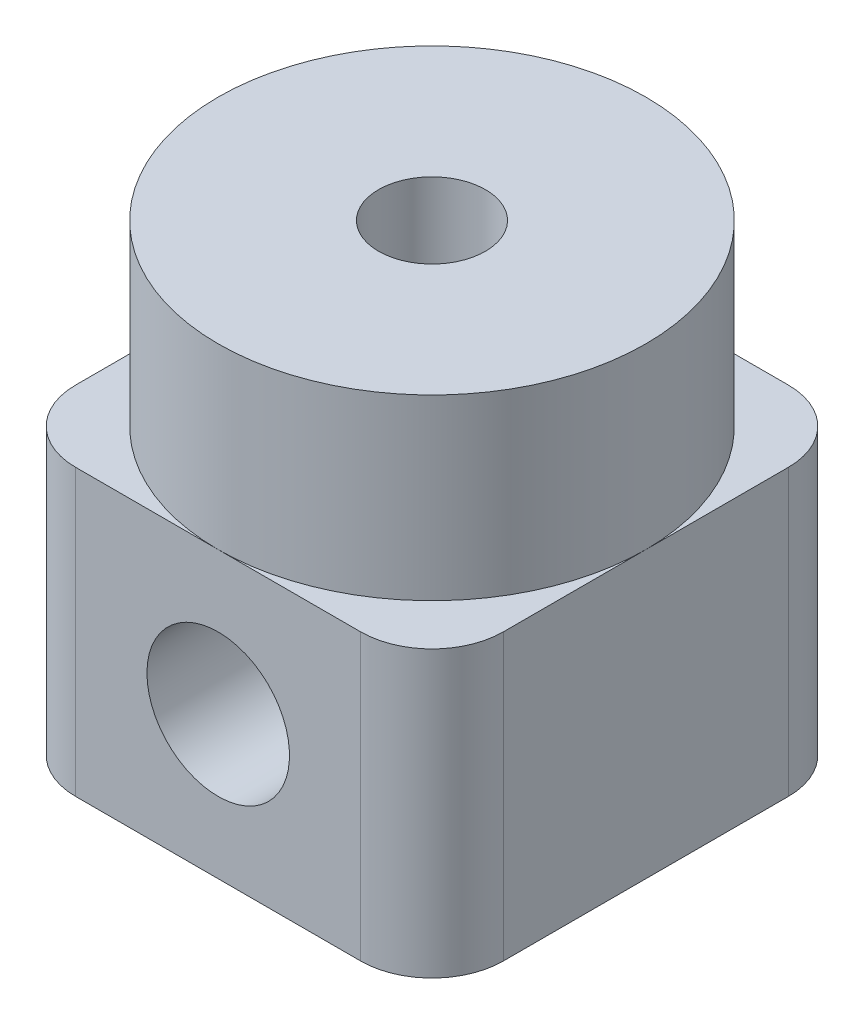
ISO-10303-21;
HEADER;
FILE_DESCRIPTION(('STEP AP214'),'2;1');
FILE_NAME('part.step','',(''),(''),'','','');
FILE_SCHEMA(('AUTOMOTIVE_DESIGN { 1 0 10303 214 1 1 1 1 }'));
ENDSEC;
DATA;
#1=APPLICATION_CONTEXT('core data for automotive mechanical design processes');
#2=APPLICATION_PROTOCOL_DEFINITION('international standard','automotive_design',2000,#1);
#3=PRODUCT_CONTEXT('',#1,'mechanical');
#4=PRODUCT('Part','Part','',(#3));
#5=PRODUCT_RELATED_PRODUCT_CATEGORY('part','',(#4));
#6=PRODUCT_DEFINITION_FORMATION('','',#4);
#7=PRODUCT_DEFINITION_CONTEXT('part definition',#1,'design');
#8=PRODUCT_DEFINITION('design','',#6,#7);
#9=PRODUCT_DEFINITION_SHAPE('','',#8);
#10=(LENGTH_UNIT() NAMED_UNIT(*) SI_UNIT(.MILLI.,.METRE.));
#11=(NAMED_UNIT(*) PLANE_ANGLE_UNIT() SI_UNIT($,.RADIAN.));
#12=(NAMED_UNIT(*) SI_UNIT($,.STERADIAN.) SOLID_ANGLE_UNIT());
#13=UNCERTAINTY_MEASURE_WITH_UNIT(LENGTH_MEASURE(1.E-05),#10,'distance_accuracy_value','');
#14=(GEOMETRIC_REPRESENTATION_CONTEXT(3) GLOBAL_UNCERTAINTY_ASSIGNED_CONTEXT((#13)) GLOBAL_UNIT_ASSIGNED_CONTEXT((#10,
#11,#12)) REPRESENTATION_CONTEXT('',''));
#15=CARTESIAN_POINT('',(0.,0.,0.));
#16=DIRECTION('',(0.,0.,1.));
#17=DIRECTION('',(1.,0.,0.));
#18=AXIS2_PLACEMENT_3D('',#15,#16,#17);
#19=CARTESIAN_POINT('',(0.,5.,0.));
#20=DIRECTION('',(0.,-1.,0.));
#21=DIRECTION('',(0.,0.,-1.));
#22=AXIS2_PLACEMENT_3D('',#19,#20,#21);
#23=CYLINDRICAL_SURFACE('',#22,6.);
#24=CARTESIAN_POINT('',(0.,5.,0.));
#25=DIRECTION('',(0.,1.,0.));
#26=DIRECTION('',(0.,0.,1.));
#27=AXIS2_PLACEMENT_3D('',#24,#25,#26);
#28=CIRCLE('',#27,6.);
#29=CARTESIAN_POINT('',(0.,5.,6.));
#30=VERTEX_POINT('',#29);
#31=EDGE_CURVE('E148',#30,#30,#28,.T.);
#32=ORIENTED_EDGE('',*,*,#31,.F.);
#33=EDGE_LOOP('',(#32));
#34=FACE_BOUND('',#33,.T.);
#35=CARTESIAN_POINT('',(0.,0.,0.));
#36=DIRECTION('',(0.,1.,0.));
#37=DIRECTION('',(0.,0.,1.));
#38=AXIS2_PLACEMENT_3D('',#35,#36,#37);
#39=CIRCLE('',#38,6.);
#40=CARTESIAN_POINT('',(0.,0.,6.));
#41=VERTEX_POINT('',#40);
#42=CARTESIAN_POINT('',(6.,0.,0.));
#43=VERTEX_POINT('',#42);
#44=EDGE_CURVE('E147',#41,#43,#39,.T.);
#45=ORIENTED_EDGE('',*,*,#44,.T.);
#46=CARTESIAN_POINT('',(0.,0.,-6.));
#47=VERTEX_POINT('',#46);
#48=EDGE_CURVE('E118',#43,#47,#39,.T.);
#49=ORIENTED_EDGE('',*,*,#48,.T.);
#50=CARTESIAN_POINT('',(-6.,0.,0.));
#51=VERTEX_POINT('',#50);
#52=EDGE_CURVE('E130',#47,#51,#39,.T.);
#53=ORIENTED_EDGE('',*,*,#52,.T.);
#54=EDGE_CURVE('E137',#51,#41,#39,.T.);
#55=ORIENTED_EDGE('',*,*,#54,.T.);
#56=EDGE_LOOP('',(#45,#49,#53,#55));
#57=FACE_BOUND('',#56,.T.);
#58=ADVANCED_FACE('F37',(#34,#57),#23,.T.);
#59=CARTESIAN_POINT('',(0.,5.,0.));
#60=DIRECTION('',(0.,1.,0.));
#61=DIRECTION('',(0.,0.,1.));
#62=AXIS2_PLACEMENT_3D('',#59,#60,#61);
#63=PLANE('',#62);
#64=CARTESIAN_POINT('',(0.,5.,0.));
#65=DIRECTION('',(0.,1.,0.));
#66=DIRECTION('',(0.,0.,1.));
#67=AXIS2_PLACEMENT_3D('',#64,#65,#66);
#68=CIRCLE('',#67,1.5);
#69=CARTESIAN_POINT('',(0.,5.,1.5));
#70=VERTEX_POINT('',#69);
#71=EDGE_CURVE('E215',#70,#70,#68,.T.);
#72=ORIENTED_EDGE('',*,*,#71,.F.);
#73=EDGE_LOOP('',(#72));
#74=FACE_BOUND('',#73,.T.);
#75=ORIENTED_EDGE('',*,*,#31,.T.);
#76=EDGE_LOOP('',(#75));
#77=FACE_BOUND('',#76,.T.);
#78=ADVANCED_FACE('F247',(#74,#77),#63,.T.);
#79=CARTESIAN_POINT('',(0.,0.,0.));
#80=DIRECTION('',(0.,1.,0.));
#81=DIRECTION('',(0.,0.,1.));
#82=AXIS2_PLACEMENT_3D('',#79,#80,#81);
#83=PLANE('',#82);
#84=DIRECTION('',(-1.,0.,0.));
#85=VECTOR('',#84,1.);
#86=CARTESIAN_POINT('',(6.,0.,6.));
#87=LINE('',#86,#85);
#88=CARTESIAN_POINT('',(4.,0.,6.));
#89=VERTEX_POINT('',#88);
#90=EDGE_CURVE('E184',#89,#41,#87,.T.);
#91=ORIENTED_EDGE('',*,*,#90,.F.);
#92=CARTESIAN_POINT('',(4.,0.,4.));
#93=DIRECTION('',(0.,1.,0.));
#94=DIRECTION('',(0.,0.,1.));
#95=AXIS2_PLACEMENT_3D('',#92,#93,#94);
#96=CIRCLE('',#95,2.);
#97=CARTESIAN_POINT('',(6.,0.,4.));
#98=VERTEX_POINT('',#97);
#99=EDGE_CURVE('E45',#89,#98,#96,.T.);
#100=ORIENTED_EDGE('',*,*,#99,.T.);
#101=DIRECTION('',(0.,0.,1.));
#102=VECTOR('',#101,1.);
#103=CARTESIAN_POINT('',(6.,0.,-6.));
#104=LINE('',#103,#102);
#105=EDGE_CURVE('E183',#43,#98,#104,.T.);
#106=ORIENTED_EDGE('',*,*,#105,.F.);
#107=ORIENTED_EDGE('',*,*,#44,.F.);
#108=EDGE_LOOP('',(#91,#100,#106,#107));
#109=FACE_BOUND('',#108,.T.);
#110=ADVANCED_FACE('F182',(#109),#83,.T.);
#111=CARTESIAN_POINT('',(6.,0.,-4.));
#112=VERTEX_POINT('',#111);
#113=EDGE_CURVE('E189',#112,#43,#104,.T.);
#114=ORIENTED_EDGE('',*,*,#113,.F.);
#115=CARTESIAN_POINT('',(4.,0.,-4.));
#116=DIRECTION('',(0.,1.,0.));
#117=DIRECTION('',(0.,0.,1.));
#118=AXIS2_PLACEMENT_3D('',#115,#116,#117);
#119=CIRCLE('',#118,2.);
#120=CARTESIAN_POINT('',(4.,0.,-6.));
#121=VERTEX_POINT('',#120);
#122=EDGE_CURVE('E120',#112,#121,#119,.T.);
#123=ORIENTED_EDGE('',*,*,#122,.T.);
#124=DIRECTION('',(-1.,0.,0.));
#125=VECTOR('',#124,1.);
#126=CARTESIAN_POINT('',(6.,0.,-6.));
#127=LINE('',#126,#125);
#128=EDGE_CURVE('E113',#121,#47,#127,.T.);
#129=ORIENTED_EDGE('',*,*,#128,.T.);
#130=ORIENTED_EDGE('',*,*,#48,.F.);
#131=EDGE_LOOP('',(#114,#123,#129,#130));
#132=FACE_BOUND('',#131,.T.);
#133=ADVANCED_FACE('F116',(#132),#83,.T.);
#134=CARTESIAN_POINT('',(-4.,0.,-6.));
#135=VERTEX_POINT('',#134);
#136=EDGE_CURVE('E125',#47,#135,#127,.T.);
#137=ORIENTED_EDGE('',*,*,#136,.T.);
#138=CARTESIAN_POINT('',(-4.,0.,-4.));
#139=DIRECTION('',(0.,1.,0.));
#140=DIRECTION('',(0.,0.,1.));
#141=AXIS2_PLACEMENT_3D('',#138,#139,#140);
#142=CIRCLE('',#141,2.);
#143=CARTESIAN_POINT('',(-6.,0.,-4.));
#144=VERTEX_POINT('',#143);
#145=EDGE_CURVE('E155',#135,#144,#142,.T.);
#146=ORIENTED_EDGE('',*,*,#145,.T.);
#147=DIRECTION('',(0.,0.,1.));
#148=VECTOR('',#147,1.);
#149=CARTESIAN_POINT('',(-6.,0.,-6.));
#150=LINE('',#149,#148);
#151=EDGE_CURVE('E133',#144,#51,#150,.T.);
#152=ORIENTED_EDGE('',*,*,#151,.T.);
#153=ORIENTED_EDGE('',*,*,#52,.F.);
#154=EDGE_LOOP('',(#137,#146,#152,#153));
#155=FACE_BOUND('',#154,.T.);
#156=ADVANCED_FACE('F131',(#155),#83,.T.);
#157=CARTESIAN_POINT('',(-6.,0.,4.));
#158=VERTEX_POINT('',#157);
#159=EDGE_CURVE('E124',#51,#158,#150,.T.);
#160=ORIENTED_EDGE('',*,*,#159,.T.);
#161=CARTESIAN_POINT('',(-4.,0.,4.));
#162=DIRECTION('',(0.,1.,0.));
#163=DIRECTION('',(0.,0.,1.));
#164=AXIS2_PLACEMENT_3D('',#161,#162,#163);
#165=CIRCLE('',#164,2.);
#166=CARTESIAN_POINT('',(-4.,0.,6.));
#167=VERTEX_POINT('',#166);
#168=EDGE_CURVE('E11',#158,#167,#165,.T.);
#169=ORIENTED_EDGE('',*,*,#168,.T.);
#170=EDGE_CURVE('E212',#41,#167,#87,.T.);
#171=ORIENTED_EDGE('',*,*,#170,.F.);
#172=ORIENTED_EDGE('',*,*,#54,.F.);
#173=EDGE_LOOP('',(#160,#169,#171,#172));
#174=FACE_BOUND('',#173,.T.);
#175=ADVANCED_FACE('F236',(#174),#83,.T.);
#176=CARTESIAN_POINT('',(6.,-8.,-6.));
#177=DIRECTION('',(0.,0.,-1.));
#178=DIRECTION('',(-1.,0.,0.));
#179=AXIS2_PLACEMENT_3D('',#176,#177,#178);
#180=PLANE('',#179);
#181=CARTESIAN_POINT('',(0.,-4.,-6.));
#182=DIRECTION('',(0.,0.,-1.));
#183=DIRECTION('',(-1.,0.,0.));
#184=AXIS2_PLACEMENT_3D('',#181,#182,#183);
#185=CIRCLE('',#184,2.);
#186=CARTESIAN_POINT('',(-2.,-4.,-6.));
#187=VERTEX_POINT('',#186);
#188=EDGE_CURVE('E221',#187,#187,#185,.T.);
#189=ORIENTED_EDGE('',*,*,#188,.F.);
#190=EDGE_LOOP('',(#189));
#191=FACE_BOUND('',#190,.T.);
#192=DIRECTION('',(-1.,0.,0.));
#193=VECTOR('',#192,1.);
#194=CARTESIAN_POINT('',(6.,-8.,-6.));
#195=LINE('',#194,#193);
#196=CARTESIAN_POINT('',(4.,-8.,-6.));
#197=VERTEX_POINT('',#196);
#198=CARTESIAN_POINT('',(-4.,-8.,-6.));
#199=VERTEX_POINT('',#198);
#200=EDGE_CURVE('E207',#197,#199,#195,.T.);
#201=ORIENTED_EDGE('',*,*,#200,.T.);
#202=DIRECTION('',(0.,1.,0.));
#203=VECTOR('',#202,1.);
#204=CARTESIAN_POINT('',(-4.,-8.,-6.));
#205=LINE('',#204,#203);
#206=EDGE_CURVE('E143',#199,#135,#205,.T.);
#207=ORIENTED_EDGE('',*,*,#206,.T.);
#208=ORIENTED_EDGE('',*,*,#136,.F.);
#209=ORIENTED_EDGE('',*,*,#128,.F.);
#210=DIRECTION('',(0.,1.,0.));
#211=VECTOR('',#210,1.);
#212=CARTESIAN_POINT('',(4.,-8.,-6.));
#213=LINE('',#212,#211);
#214=EDGE_CURVE('E152',#121,#197,#213,.F.);
#215=ORIENTED_EDGE('',*,*,#214,.T.);
#216=EDGE_LOOP('',(#201,#207,#208,#209,#215));
#217=FACE_BOUND('',#216,.T.);
#218=ADVANCED_FACE('F141',(#191,#217),#180,.T.);
#219=CARTESIAN_POINT('',(6.,-8.,-6.));
#220=DIRECTION('',(-1.,0.,0.));
#221=DIRECTION('',(0.,0.,1.));
#222=AXIS2_PLACEMENT_3D('',#219,#220,#221);
#223=PLANE('',#222);
#224=DIRECTION('',(0.,0.,1.));
#225=VECTOR('',#224,1.);
#226=CARTESIAN_POINT('',(6.,-8.,-6.));
#227=LINE('',#226,#225);
#228=CARTESIAN_POINT('',(6.,-8.,-4.));
#229=VERTEX_POINT('',#228);
#230=CARTESIAN_POINT('',(6.,-8.,4.));
#231=VERTEX_POINT('',#230);
#232=EDGE_CURVE('E199',#229,#231,#227,.T.);
#233=ORIENTED_EDGE('',*,*,#232,.F.);
#234=DIRECTION('',(0.,1.,0.));
#235=VECTOR('',#234,1.);
#236=CARTESIAN_POINT('',(6.,0.,-4.));
#237=LINE('',#236,#235);
#238=EDGE_CURVE('E172',#229,#112,#237,.T.);
#239=ORIENTED_EDGE('',*,*,#238,.T.);
#240=ORIENTED_EDGE('',*,*,#113,.T.);
#241=ORIENTED_EDGE('',*,*,#105,.T.);
#242=DIRECTION('',(0.,1.,0.));
#243=VECTOR('',#242,1.);
#244=CARTESIAN_POINT('',(6.,-8.,4.));
#245=LINE('',#244,#243);
#246=EDGE_CURVE('E170',#98,#231,#245,.F.);
#247=ORIENTED_EDGE('',*,*,#246,.T.);
#248=EDGE_LOOP('',(#233,#239,#240,#241,#247));
#249=FACE_BOUND('',#248,.T.);
#250=ADVANCED_FACE('F187',(#249),#223,.F.);
#251=CARTESIAN_POINT('',(6.,-8.,6.));
#252=DIRECTION('',(0.,0.,-1.));
#253=DIRECTION('',(-1.,0.,0.));
#254=AXIS2_PLACEMENT_3D('',#251,#252,#253);
#255=PLANE('',#254);
#256=CARTESIAN_POINT('',(0.,-4.,6.));
#257=DIRECTION('',(0.,0.,-1.));
#258=DIRECTION('',(-1.,0.,0.));
#259=AXIS2_PLACEMENT_3D('',#256,#257,#258);
#260=CIRCLE('',#259,2.);
#261=CARTESIAN_POINT('',(-2.,-4.,6.));
#262=VERTEX_POINT('',#261);
#263=EDGE_CURVE('E218',#262,#262,#260,.T.);
#264=ORIENTED_EDGE('',*,*,#263,.T.);
#265=EDGE_LOOP('',(#264));
#266=FACE_BOUND('',#265,.T.);
#267=DIRECTION('',(-1.,0.,0.));
#268=VECTOR('',#267,1.);
#269=CARTESIAN_POINT('',(6.,-8.,6.));
#270=LINE('',#269,#268);
#271=CARTESIAN_POINT('',(4.,-8.,6.));
#272=VERTEX_POINT('',#271);
#273=CARTESIAN_POINT('',(-4.,-8.,6.));
#274=VERTEX_POINT('',#273);
#275=EDGE_CURVE('E197',#272,#274,#270,.T.);
#276=ORIENTED_EDGE('',*,*,#275,.F.);
#277=DIRECTION('',(0.,1.,0.));
#278=VECTOR('',#277,1.);
#279=CARTESIAN_POINT('',(4.,-8.,6.));
#280=LINE('',#279,#278);
#281=EDGE_CURVE('E178',#272,#89,#280,.T.);
#282=ORIENTED_EDGE('',*,*,#281,.T.);
#283=ORIENTED_EDGE('',*,*,#90,.T.);
#284=ORIENTED_EDGE('',*,*,#170,.T.);
#285=DIRECTION('',(0.,1.,0.));
#286=VECTOR('',#285,1.);
#287=CARTESIAN_POINT('',(-4.,-8.,6.));
#288=LINE('',#287,#286);
#289=EDGE_CURVE('E176',#167,#274,#288,.F.);
#290=ORIENTED_EDGE('',*,*,#289,.T.);
#291=EDGE_LOOP('',(#276,#282,#283,#284,#290));
#292=FACE_BOUND('',#291,.T.);
#293=ADVANCED_FACE('F201',(#266,#292),#255,.F.);
#294=CARTESIAN_POINT('',(-6.,-8.,-6.));
#295=DIRECTION('',(-1.,0.,0.));
#296=DIRECTION('',(0.,0.,1.));
#297=AXIS2_PLACEMENT_3D('',#294,#295,#296);
#298=PLANE('',#297);
#299=ORIENTED_EDGE('',*,*,#151,.F.);
#300=DIRECTION('',(0.,1.,0.));
#301=VECTOR('',#300,1.);
#302=CARTESIAN_POINT('',(-6.,-8.,-4.));
#303=LINE('',#302,#301);
#304=CARTESIAN_POINT('',(-6.,-8.,-4.));
#305=VERTEX_POINT('',#304);
#306=EDGE_CURVE('E160',#144,#305,#303,.F.);
#307=ORIENTED_EDGE('',*,*,#306,.T.);
#308=DIRECTION('',(0.,0.,1.));
#309=VECTOR('',#308,1.);
#310=CARTESIAN_POINT('',(-6.,-8.,-6.));
#311=LINE('',#310,#309);
#312=CARTESIAN_POINT('',(-6.,-8.,4.));
#313=VERTEX_POINT('',#312);
#314=EDGE_CURVE('E203',#305,#313,#311,.T.);
#315=ORIENTED_EDGE('',*,*,#314,.T.);
#316=DIRECTION('',(0.,1.,0.));
#317=VECTOR('',#316,1.);
#318=CARTESIAN_POINT('',(-6.,0.,4.));
#319=LINE('',#318,#317);
#320=EDGE_CURVE('E157',#313,#158,#319,.T.);
#321=ORIENTED_EDGE('',*,*,#320,.T.);
#322=ORIENTED_EDGE('',*,*,#159,.F.);
#323=EDGE_LOOP('',(#299,#307,#315,#321,#322));
#324=FACE_BOUND('',#323,.T.);
#325=ADVANCED_FACE('F277',(#324),#298,.T.);
#326=CARTESIAN_POINT('',(0.,-8.,0.));
#327=DIRECTION('',(0.,1.,0.));
#328=DIRECTION('',(0.,0.,1.));
#329=AXIS2_PLACEMENT_3D('',#326,#327,#328);
#330=PLANE('',#329);
#331=ORIENTED_EDGE('',*,*,#314,.F.);
#332=CARTESIAN_POINT('',(-4.,-8.,-4.));
#333=DIRECTION('',(0.,1.,0.));
#334=DIRECTION('',(0.,0.,1.));
#335=AXIS2_PLACEMENT_3D('',#332,#333,#334);
#336=CIRCLE('',#335,2.);
#337=EDGE_CURVE('E168',#305,#199,#336,.F.);
#338=ORIENTED_EDGE('',*,*,#337,.T.);
#339=ORIENTED_EDGE('',*,*,#200,.F.);
#340=CARTESIAN_POINT('',(4.,-8.,-4.));
#341=DIRECTION('',(0.,1.,0.));
#342=DIRECTION('',(0.,0.,1.));
#343=AXIS2_PLACEMENT_3D('',#340,#341,#342);
#344=CIRCLE('',#343,2.);
#345=EDGE_CURVE('E166',#197,#229,#344,.F.);
#346=ORIENTED_EDGE('',*,*,#345,.T.);
#347=ORIENTED_EDGE('',*,*,#232,.T.);
#348=CARTESIAN_POINT('',(4.,-8.,4.));
#349=DIRECTION('',(0.,1.,0.));
#350=DIRECTION('',(0.,0.,1.));
#351=AXIS2_PLACEMENT_3D('',#348,#349,#350);
#352=CIRCLE('',#351,2.);
#353=EDGE_CURVE('E164',#231,#272,#352,.F.);
#354=ORIENTED_EDGE('',*,*,#353,.T.);
#355=ORIENTED_EDGE('',*,*,#275,.T.);
#356=CARTESIAN_POINT('',(-4.,-8.,4.));
#357=DIRECTION('',(0.,1.,0.));
#358=DIRECTION('',(0.,0.,1.));
#359=AXIS2_PLACEMENT_3D('',#356,#357,#358);
#360=CIRCLE('',#359,2.);
#361=EDGE_CURVE('E162',#274,#313,#360,.F.);
#362=ORIENTED_EDGE('',*,*,#361,.T.);
#363=EDGE_LOOP('',(#331,#338,#339,#346,#347,#354,#355,#362));
#364=FACE_BOUND('',#363,.T.);
#365=ADVANCED_FACE('F196',(#364),#330,.F.);
#366=CARTESIAN_POINT('',(-4.,-8.,-4.));
#367=DIRECTION('',(0.,1.,0.));
#368=DIRECTION('',(0.,0.,1.));
#369=AXIS2_PLACEMENT_3D('',#366,#367,#368);
#370=CYLINDRICAL_SURFACE('',#369,2.);
#371=ORIENTED_EDGE('',*,*,#337,.F.);
#372=ORIENTED_EDGE('',*,*,#306,.F.);
#373=ORIENTED_EDGE('',*,*,#145,.F.);
#374=ORIENTED_EDGE('',*,*,#206,.F.);
#375=EDGE_LOOP('',(#371,#372,#373,#374));
#376=FACE_BOUND('',#375,.T.);
#377=ADVANCED_FACE('F256',(#376),#370,.T.);
#378=CARTESIAN_POINT('',(4.,-8.,-4.));
#379=DIRECTION('',(0.,-1.,0.));
#380=DIRECTION('',(0.,0.,-1.));
#381=AXIS2_PLACEMENT_3D('',#378,#379,#380);
#382=CYLINDRICAL_SURFACE('',#381,2.);
#383=ORIENTED_EDGE('',*,*,#345,.F.);
#384=ORIENTED_EDGE('',*,*,#214,.F.);
#385=ORIENTED_EDGE('',*,*,#122,.F.);
#386=ORIENTED_EDGE('',*,*,#238,.F.);
#387=EDGE_LOOP('',(#383,#384,#385,#386));
#388=FACE_BOUND('',#387,.T.);
#389=ADVANCED_FACE('F259',(#388),#382,.T.);
#390=CARTESIAN_POINT('',(4.,-8.,4.));
#391=DIRECTION('',(0.,1.,0.));
#392=DIRECTION('',(0.,0.,1.));
#393=AXIS2_PLACEMENT_3D('',#390,#391,#392);
#394=CYLINDRICAL_SURFACE('',#393,2.);
#395=ORIENTED_EDGE('',*,*,#353,.F.);
#396=ORIENTED_EDGE('',*,*,#246,.F.);
#397=ORIENTED_EDGE('',*,*,#99,.F.);
#398=ORIENTED_EDGE('',*,*,#281,.F.);
#399=EDGE_LOOP('',(#395,#396,#397,#398));
#400=FACE_BOUND('',#399,.T.);
#401=ADVANCED_FACE('F191',(#400),#394,.T.);
#402=CARTESIAN_POINT('',(-4.,-8.,4.));
#403=DIRECTION('',(0.,-1.,0.));
#404=DIRECTION('',(0.,0.,-1.));
#405=AXIS2_PLACEMENT_3D('',#402,#403,#404);
#406=CYLINDRICAL_SURFACE('',#405,2.);
#407=ORIENTED_EDGE('',*,*,#361,.F.);
#408=ORIENTED_EDGE('',*,*,#289,.F.);
#409=ORIENTED_EDGE('',*,*,#168,.F.);
#410=ORIENTED_EDGE('',*,*,#320,.F.);
#411=EDGE_LOOP('',(#407,#408,#409,#410));
#412=FACE_BOUND('',#411,.T.);
#413=ADVANCED_FACE('F39',(#412),#406,.T.);
#414=CARTESIAN_POINT('',(0.,0.,0.));
#415=DIRECTION('',(0.,1.,0.));
#416=DIRECTION('',(0.,0.,1.));
#417=AXIS2_PLACEMENT_3D('',#414,#415,#416);
#418=CYLINDRICAL_SURFACE('',#417,1.5);
#419=CARTESIAN_POINT('',(0.,0.,0.));
#420=DIRECTION('',(0.,1.,0.));
#421=DIRECTION('',(0.,0.,1.));
#422=AXIS2_PLACEMENT_3D('',#419,#420,#421);
#423=CIRCLE('',#422,1.5);
#424=CARTESIAN_POINT('',(0.,0.,1.5));
#425=VERTEX_POINT('',#424);
#426=EDGE_CURVE('E144',#425,#425,#423,.T.);
#427=ORIENTED_EDGE('',*,*,#426,.F.);
#428=EDGE_LOOP('',(#427));
#429=FACE_BOUND('',#428,.T.);
#430=ORIENTED_EDGE('',*,*,#71,.T.);
#431=EDGE_LOOP('',(#430));
#432=FACE_BOUND('',#431,.T.);
#433=ADVANCED_FACE('F267',(#429,#432),#418,.F.);
#434=CARTESIAN_POINT('',(0.,0.,0.));
#435=DIRECTION('',(0.,1.,0.));
#436=DIRECTION('',(0.,0.,1.));
#437=AXIS2_PLACEMENT_3D('',#434,#435,#436);
#438=PLANE('',#437);
#439=ORIENTED_EDGE('',*,*,#426,.T.);
#440=EDGE_LOOP('',(#439));
#441=FACE_BOUND('',#440,.T.);
#442=ADVANCED_FACE('F231',(#441),#438,.T.);
#443=CARTESIAN_POINT('',(0.,-4.,6.));
#444=DIRECTION('',(0.,0.,-1.));
#445=DIRECTION('',(-1.,0.,0.));
#446=AXIS2_PLACEMENT_3D('',#443,#444,#445);
#447=CYLINDRICAL_SURFACE('',#446,2.);
#448=ORIENTED_EDGE('',*,*,#263,.F.);
#449=EDGE_LOOP('',(#448));
#450=FACE_BOUND('',#449,.T.);
#451=ORIENTED_EDGE('',*,*,#188,.T.);
#452=EDGE_LOOP('',(#451));
#453=FACE_BOUND('',#452,.T.);
#454=ADVANCED_FACE('F228',(#450,#453),#447,.F.);
#455=CLOSED_SHELL('',(#58,#78,#110,#133,#156,#175,#218,#250,#293,#325,#365,#377,#389,#401,#413,
#433,#442,#454));
#456=MANIFOLD_SOLID_BREP('B2',#455);
#457=ADVANCED_BREP_SHAPE_REPRESENTATION('',(#18,#456),#14);
#458=SHAPE_DEFINITION_REPRESENTATION(#9,#457);
ENDSEC;
END-ISO-10303-21;
